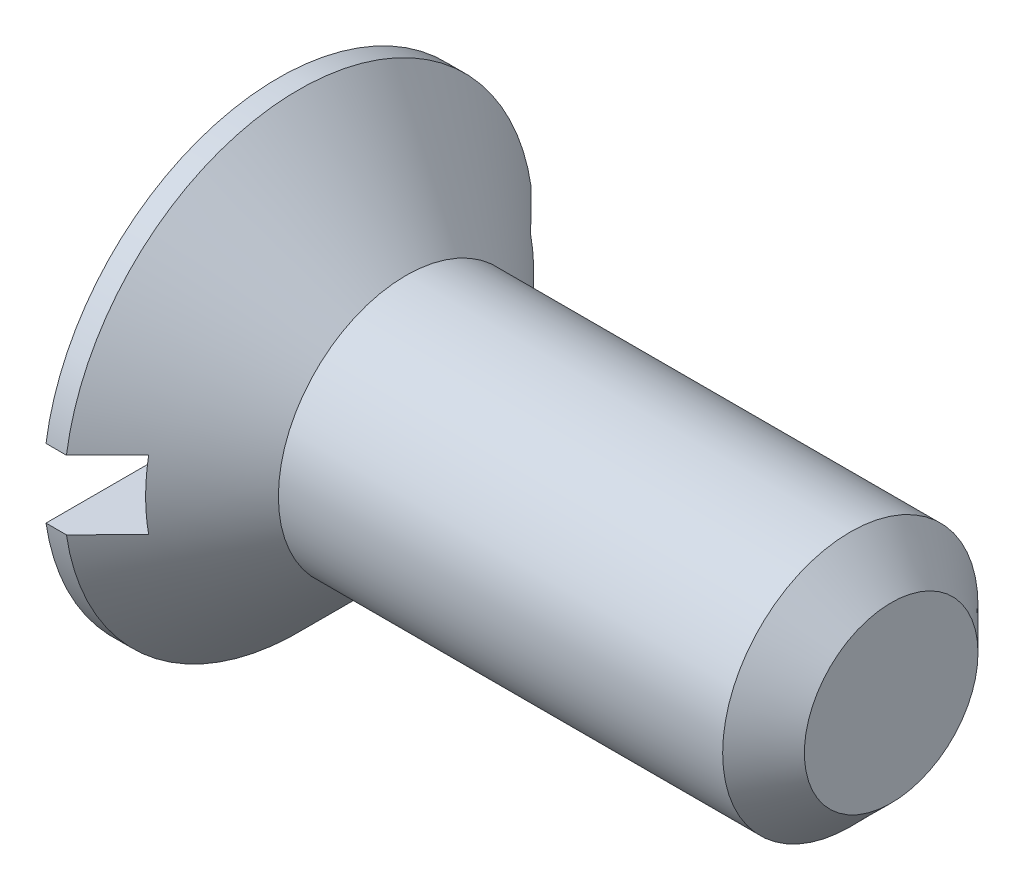
ISO-10303-21;
HEADER;
FILE_DESCRIPTION(('STEP AP214'),'2;1');
FILE_NAME('part.step','',(''),(''),'','','');
FILE_SCHEMA(('AUTOMOTIVE_DESIGN { 1 0 10303 214 1 1 1 1 }'));
ENDSEC;
DATA;
#1=APPLICATION_CONTEXT('core data for automotive mechanical design processes');
#2=APPLICATION_PROTOCOL_DEFINITION('international standard','automotive_design',2000,#1);
#3=PRODUCT_CONTEXT('',#1,'mechanical');
#4=PRODUCT('Part','Part','',(#3));
#5=PRODUCT_RELATED_PRODUCT_CATEGORY('part','',(#4));
#6=PRODUCT_DEFINITION_FORMATION('','',#4);
#7=PRODUCT_DEFINITION_CONTEXT('part definition',#1,'design');
#8=PRODUCT_DEFINITION('design','',#6,#7);
#9=PRODUCT_DEFINITION_SHAPE('','',#8);
#10=(LENGTH_UNIT() NAMED_UNIT(*) SI_UNIT(.MILLI.,.METRE.));
#11=(NAMED_UNIT(*) PLANE_ANGLE_UNIT() SI_UNIT($,.RADIAN.));
#12=(NAMED_UNIT(*) SI_UNIT($,.STERADIAN.) SOLID_ANGLE_UNIT());
#13=UNCERTAINTY_MEASURE_WITH_UNIT(LENGTH_MEASURE(1.E-05),#10,'distance_accuracy_value','');
#14=(GEOMETRIC_REPRESENTATION_CONTEXT(3) GLOBAL_UNCERTAINTY_ASSIGNED_CONTEXT((#13)) GLOBAL_UNIT_ASSIGNED_CONTEXT((#10,
#11,#12)) REPRESENTATION_CONTEXT('',''));
#15=CARTESIAN_POINT('',(0.,0.,0.));
#16=DIRECTION('',(0.,0.,1.));
#17=DIRECTION('',(1.,0.,0.));
#18=AXIS2_PLACEMENT_3D('',#15,#16,#17);
#19=CARTESIAN_POINT('',(0.,0.,0.));
#20=DIRECTION('',(-1.,0.,0.));
#21=DIRECTION('',(0.,0.,1.));
#22=AXIS2_PLACEMENT_3D('',#19,#20,#21);
#23=CYLINDRICAL_SURFACE('',#22,4.6);
#24=CARTESIAN_POINT('',(0.400000000000006,0.,0.));
#25=DIRECTION('',(-1.,0.,0.));
#26=DIRECTION('',(0.,0.,1.));
#27=AXIS2_PLACEMENT_3D('',#24,#25,#26);
#28=CIRCLE('',#27,4.6);
#29=CARTESIAN_POINT('',(0.400000000000006,-0.675,-4.55020603929097));
#30=VERTEX_POINT('',#29);
#31=CARTESIAN_POINT('',(0.400000000000005,-0.675,4.55020603929097));
#32=VERTEX_POINT('',#31);
#33=EDGE_CURVE('E109',#30,#32,#28,.T.);
#34=ORIENTED_EDGE('',*,*,#33,.T.);
#35=DIRECTION('',(-1.,0.,0.));
#36=VECTOR('',#35,1.);
#37=CARTESIAN_POINT('',(0.,-0.675,4.55020603929097));
#38=LINE('',#37,#36);
#39=CARTESIAN_POINT('',(0.,-0.675,4.55020603929097));
#40=VERTEX_POINT('',#39);
#41=EDGE_CURVE('E110',#32,#40,#38,.T.);
#42=ORIENTED_EDGE('',*,*,#41,.T.);
#43=CARTESIAN_POINT('',(0.,0.,0.));
#44=DIRECTION('',(-1.,0.,0.));
#45=DIRECTION('',(0.,0.,1.));
#46=AXIS2_PLACEMENT_3D('',#43,#44,#45);
#47=CIRCLE('',#46,4.6);
#48=CARTESIAN_POINT('',(0.,-0.675,-4.55020603929097));
#49=VERTEX_POINT('',#48);
#50=EDGE_CURVE('E143',#49,#40,#47,.T.);
#51=ORIENTED_EDGE('',*,*,#50,.F.);
#52=DIRECTION('',(-1.,0.,0.));
#53=VECTOR('',#52,1.);
#54=CARTESIAN_POINT('',(0.,-0.675,-4.55020603929097));
#55=LINE('',#54,#53);
#56=EDGE_CURVE('E52',#49,#30,#55,.F.);
#57=ORIENTED_EDGE('',*,*,#56,.T.);
#58=EDGE_LOOP('',(#34,#42,#51,#57));
#59=FACE_BOUND('',#58,.T.);
#60=ADVANCED_FACE('F37',(#59),#23,.T.);
#61=CARTESIAN_POINT('',(0.,0.,0.));
#62=DIRECTION('',(1.,0.,0.));
#63=DIRECTION('',(0.,0.,-1.));
#64=AXIS2_PLACEMENT_3D('',#61,#62,#63);
#65=PLANE('',#64);
#66=CARTESIAN_POINT('',(0.,0.675,4.55020603929097));
#67=VERTEX_POINT('',#66);
#68=CARTESIAN_POINT('',(0.,0.675,-4.55020603929097));
#69=VERTEX_POINT('',#68);
#70=EDGE_CURVE('E150',#67,#69,#47,.T.);
#71=ORIENTED_EDGE('',*,*,#70,.T.);
#72=DIRECTION('',(0.,0.,1.));
#73=VECTOR('',#72,1.);
#74=CARTESIAN_POINT('',(0.,0.675,0.));
#75=LINE('',#74,#73);
#76=EDGE_CURVE('E166',#69,#67,#75,.T.);
#77=ORIENTED_EDGE('',*,*,#76,.T.);
#78=EDGE_LOOP('',(#71,#77));
#79=FACE_BOUND('',#78,.T.);
#80=ADVANCED_FACE('F172',(#79),#65,.F.);
#81=CARTESIAN_POINT('',(12.,0.,0.));
#82=DIRECTION('',(-1.,0.,0.));
#83=DIRECTION('',(0.,0.,1.));
#84=AXIS2_PLACEMENT_3D('',#81,#82,#83);
#85=CYLINDRICAL_SURFACE('',#84,2.5);
#86=CARTESIAN_POINT('',(11.2,0.,0.));
#87=DIRECTION('',(1.,0.,0.));
#88=DIRECTION('',(0.,0.,-1.));
#89=AXIS2_PLACEMENT_3D('',#86,#87,#88);
#90=CIRCLE('',#89,2.5);
#91=CARTESIAN_POINT('',(11.2,0.,-2.5));
#92=VERTEX_POINT('',#91);
#93=EDGE_CURVE('E157',#92,#92,#90,.F.);
#94=ORIENTED_EDGE('',*,*,#93,.T.);
#95=EDGE_LOOP('',(#94));
#96=FACE_BOUND('',#95,.T.);
#97=CARTESIAN_POINT('',(2.5,0.,0.));
#98=DIRECTION('',(-1.,0.,0.));
#99=DIRECTION('',(0.,0.,1.));
#100=AXIS2_PLACEMENT_3D('',#97,#98,#99);
#101=CIRCLE('',#100,2.5);
#102=CARTESIAN_POINT('',(2.5,0.,2.5));
#103=VERTEX_POINT('',#102);
#104=EDGE_CURVE('E161',#103,#103,#101,.T.);
#105=ORIENTED_EDGE('',*,*,#104,.F.);
#106=EDGE_LOOP('',(#105));
#107=FACE_BOUND('',#106,.T.);
#108=ADVANCED_FACE('F174',(#96,#107),#85,.T.);
#109=CARTESIAN_POINT('',(12.,0.,0.));
#110=DIRECTION('',(1.,0.,0.));
#111=DIRECTION('',(0.,0.,-1.));
#112=AXIS2_PLACEMENT_3D('',#109,#110,#111);
#113=PLANE('',#112);
#114=CARTESIAN_POINT('',(12.,0.,0.));
#115=DIRECTION('',(1.,0.,0.));
#116=DIRECTION('',(0.,0.,-1.));
#117=AXIS2_PLACEMENT_3D('',#114,#115,#116);
#118=CIRCLE('',#117,1.7);
#119=CARTESIAN_POINT('',(12.,0.,-1.7));
#120=VERTEX_POINT('',#119);
#121=EDGE_CURVE('E153',#120,#120,#118,.T.);
#122=ORIENTED_EDGE('',*,*,#121,.T.);
#123=EDGE_LOOP('',(#122));
#124=FACE_BOUND('',#123,.T.);
#125=ADVANCED_FACE('F181',(#124),#113,.T.);
#126=CARTESIAN_POINT('',(12.,0.,0.));
#127=DIRECTION('',(-1.,0.,0.));
#128=DIRECTION('',(0.,0.,1.));
#129=AXIS2_PLACEMENT_3D('',#126,#127,#128);
#130=CONICAL_SURFACE('',#129,1.7,0.785398163397448);
#131=ORIENTED_EDGE('',*,*,#93,.F.);
#132=EDGE_LOOP('',(#131));
#133=FACE_BOUND('',#132,.T.);
#134=ORIENTED_EDGE('',*,*,#121,.F.);
#135=EDGE_LOOP('',(#134));
#136=FACE_BOUND('',#135,.T.);
#137=ADVANCED_FACE('F39',(#133,#136),#130,.T.);
#138=CARTESIAN_POINT('',(0.400000000000006,0.675,4.55020603929097));
#139=VERTEX_POINT('',#138);
#140=CARTESIAN_POINT('',(0.400000000000005,0.675,-4.55020603929097));
#141=VERTEX_POINT('',#140);
#142=EDGE_CURVE('E127',#139,#141,#28,.T.);
#143=ORIENTED_EDGE('',*,*,#142,.T.);
#144=DIRECTION('',(-1.,0.,0.));
#145=VECTOR('',#144,1.);
#146=CARTESIAN_POINT('',(0.,0.675,-4.55020603929097));
#147=LINE('',#146,#145);
#148=EDGE_CURVE('E129',#141,#69,#147,.T.);
#149=ORIENTED_EDGE('',*,*,#148,.T.);
#150=ORIENTED_EDGE('',*,*,#70,.F.);
#151=DIRECTION('',(-1.,0.,0.));
#152=VECTOR('',#151,1.);
#153=CARTESIAN_POINT('',(0.,0.675,4.55020603929097));
#154=LINE('',#153,#152);
#155=EDGE_CURVE('E128',#67,#139,#154,.F.);
#156=ORIENTED_EDGE('',*,*,#155,.T.);
#157=EDGE_LOOP('',(#143,#149,#150,#156));
#158=FACE_BOUND('',#157,.T.);
#159=ADVANCED_FACE('F139',(#158),#23,.T.);
#160=CARTESIAN_POINT('',(2.5,0.,0.));
#161=DIRECTION('',(-1.,0.,0.));
#162=DIRECTION('',(0.,0.,1.));
#163=AXIS2_PLACEMENT_3D('',#160,#161,#162);
#164=CONICAL_SURFACE('',#163,2.5,0.78539816339745);
#165=CARTESIAN_POINT('',(1.2,0.,0.));
#166=DIRECTION('',(1.,0.,0.));
#167=DIRECTION('',(0.,0.,-1.));
#168=AXIS2_PLACEMENT_3D('',#165,#166,#167);
#169=CIRCLE('',#168,3.8);
#170=CARTESIAN_POINT('',(1.2,-0.675,-3.7395688254129));
#171=VERTEX_POINT('',#170);
#172=CARTESIAN_POINT('',(1.2,0.675,-3.7395688254129));
#173=VERTEX_POINT('',#172);
#174=EDGE_CURVE('E11',#171,#173,#169,.T.);
#175=ORIENTED_EDGE('',*,*,#174,.T.);
#176=CARTESIAN_POINT('',(-5.14103026269529,0.675000000000001,10.1185408922879));
#177=CARTESIAN_POINT('',(-4.79289882358009,0.675,9.76962957456254));
#178=CARTESIAN_POINT('',(-4.44480155921046,0.675,9.42068413514975));
#179=CARTESIAN_POINT('',(-3.7487119301813,0.675,8.72267368778365));
#180=CARTESIAN_POINT('',(-3.40071956793741,0.675,8.37360867742145));
#181=CARTESIAN_POINT('',(-2.70472151525276,0.675,7.6751524113005));
#182=CARTESIAN_POINT('',(-2.3567159011481,0.675,7.32576107946031));
#183=CARTESIAN_POINT('',(-1.66095133237253,0.675,6.62674746455806));
#184=CARTESIAN_POINT('',(-1.31319237268689,0.675,6.27712518648771));
#185=CARTESIAN_POINT('',(-0.615198666465887,0.675,5.5746263082885));
#186=CARTESIAN_POINT('',(-0.264967065731521,0.675,5.22174658047516));
#187=CARTESIAN_POINT('',(0.259863029091567,0.675,4.69189172390126));
#188=CARTESIAN_POINT('',(0.434725849565922,0.675,4.51517847709478));
#189=CARTESIAN_POINT('',(0.784197549868638,0.675,4.1615032771802));
#190=CARTESIAN_POINT('',(0.958806431336325,0.675,3.98454132569226));
#191=CARTESIAN_POINT('',(1.30760251360431,0.675,3.63030802297131));
#192=CARTESIAN_POINT('',(1.48178982653076,0.675,3.45303678224496));
#193=CARTESIAN_POINT('',(1.8295925296867,0.675,3.09792543601787));
#194=CARTESIAN_POINT('',(2.00320790559689,0.675,2.92008531649082));
#195=CARTESIAN_POINT('',(2.34947157398948,0.675,2.5635019262022));
#196=CARTESIAN_POINT('',(2.52211997424492,0.675,2.38475876048911));
#197=CARTESIAN_POINT('',(2.7797242498298,0.675,2.11534150573261));
#198=CARTESIAN_POINT('',(2.86536257490605,0.675,2.025320497708));
#199=CARTESIAN_POINT('',(3.03596515937131,0.675,1.84464259536496));
#200=CARTESIAN_POINT('',(3.12092942879838,0.675,1.75398571055405));
#201=CARTESIAN_POINT('',(3.2512477642699,0.675,1.61333546698152));
#202=CARTESIAN_POINT('',(3.29696843998676,0.675,1.56368199626714));
#203=CARTESIAN_POINT('',(3.38800725086161,0.675,1.46400460820766));
#204=CARTESIAN_POINT('',(3.43332537641235,0.675,1.41398068207326));
#205=CARTESIAN_POINT('',(3.52343220875017,0.675,1.31344015006122));
#206=CARTESIAN_POINT('',(3.56822081231717,0.675,1.2629234515188));
#207=CARTESIAN_POINT('',(3.65705632394095,0.675,1.16124382235821));
#208=CARTESIAN_POINT('',(3.70110326872385,0.675,1.11008092396));
#209=CARTESIAN_POINT('',(3.77795109002178,0.675,1.01893526420016));
#210=CARTESIAN_POINT('',(3.81097153083123,0.675,0.979138073286284));
#211=CARTESIAN_POINT('',(3.87616144094943,0.675,0.898853910317401));
#212=CARTESIAN_POINT('',(3.90833096455003,0.675,0.858366982542628));
#213=CARTESIAN_POINT('',(3.97149667651463,0.675,0.776451305154085));
#214=CARTESIAN_POINT('',(4.00249230104566,0.675,0.735022117879748));
#215=CARTESIAN_POINT('',(4.06273707248955,0.675,0.650920658969039));
#216=CARTESIAN_POINT('',(4.09198679799452,0.675,0.608248806206697));
#217=CARTESIAN_POINT('',(4.1514758242758,0.675,0.515559434753144));
#218=CARTESIAN_POINT('',(4.18135351051047,0.675,0.46530584224434));
#219=CARTESIAN_POINT('',(4.23543930623563,0.675,0.361764282597546));
#220=CARTESIAN_POINT('',(4.25965593123721,0.675,0.308481024840851));
#221=CARTESIAN_POINT('',(4.29285294829624,0.675,0.213969622658689));
#222=CARTESIAN_POINT('',(4.30420664088936,0.675,0.173608441656053));
#223=CARTESIAN_POINT('',(4.31998732216108,0.675,0.0916129028989921));
#224=CARTESIAN_POINT('',(4.32443797638003,0.675,0.0499833961584734));
#225=CARTESIAN_POINT('',(4.32546222538945,0.675,-0.0335675330059821));
#226=CARTESIAN_POINT('',(4.3220001417335,0.675,-0.0754894245601723));
#227=CARTESIAN_POINT('',(4.30793123699927,0.675,-0.158151576059504));
#228=CARTESIAN_POINT('',(4.29730513813417,0.675,-0.198888337571242));
#229=CARTESIAN_POINT('',(4.27005389788744,0.675,-0.280658350819791));
#230=CARTESIAN_POINT('',(4.25313711973156,0.675,-0.321589942229873));
#231=CARTESIAN_POINT('',(4.21535099736376,0.675,-0.401617263598404));
#232=CARTESIAN_POINT('',(4.19447431006551,0.675,-0.440709411765164));
#233=CARTESIAN_POINT('',(4.14993101684088,0.675,-0.517671391488483));
#234=CARTESIAN_POINT('',(4.1262429196506,0.675,-0.555528558029601));
#235=CARTESIAN_POINT('',(4.07709263435949,0.675,-0.630010620469065));
#236=CARTESIAN_POINT('',(4.05163202132958,0.675,-0.666636568577121));
#237=CARTESIAN_POINT('',(3.99713485116024,0.675,-0.742198320333047));
#238=CARTESIAN_POINT('',(3.96798173570807,0.675,-0.781049467298038));
#239=CARTESIAN_POINT('',(3.90862508022237,0.675,-0.85794370344578));
#240=CARTESIAN_POINT('',(3.87842139938344,0.675,-0.89598668320213));
#241=CARTESIAN_POINT('',(3.78665550291678,0.675,-1.0092369115181));
#242=CARTESIAN_POINT('',(3.72396630182201,0.675,-1.08352811117157));
#243=CARTESIAN_POINT('',(3.59677619963588,0.675,-1.23075809888945));
#244=CARTESIAN_POINT('',(3.53227223494173,0.675,-1.30369420613128));
#245=CARTESIAN_POINT('',(3.4021993807258,0.675,-1.44857109297886));
#246=CARTESIAN_POINT('',(3.33663080224324,0.675,-1.52051215231615));
#247=CARTESIAN_POINT('',(3.2049836926219,0.675,-1.66349952099614));
#248=CARTESIAN_POINT('',(3.13890746185963,0.675,-1.73454795550912));
#249=CARTESIAN_POINT('',(3.00624644085965,0.675,-1.87617751644498));
#250=CARTESIAN_POINT('',(2.93966161426527,0.675,-1.946758608774));
#251=CARTESIAN_POINT('',(2.80619732381264,0.675,-2.08749673474619));
#252=CARTESIAN_POINT('',(2.73931825526489,0.675,-2.15765414369846));
#253=CARTESIAN_POINT('',(2.60528604522793,0.675,-2.29770320663561));
#254=CARTESIAN_POINT('',(2.53813291046404,0.675,-2.36759486706137));
#255=CARTESIAN_POINT('',(2.33696131954182,0.675,-2.57634206727043));
#256=CARTESIAN_POINT('',(2.2026323079358,0.675,-2.71489822056884));
#257=CARTESIAN_POINT('',(1.93345191078397,0.675,-2.99150242168728));
#258=CARTESIAN_POINT('',(1.79860052307259,0.675,-3.12955046739625));
#259=CARTESIAN_POINT('',(1.39352373969183,0.675,-3.54319294674175));
#260=CARTESIAN_POINT('',(1.12278087773808,0.675,-3.81828040668613));
#261=CARTESIAN_POINT('',(0.580484795057651,0.675,-4.36788477847732));
#262=CARTESIAN_POINT('',(0.308931278914151,0.675,-4.6424013982682));
#263=CARTESIAN_POINT('',(-0.234589050858713,0.675,-5.19102029542287));
#264=CARTESIAN_POINT('',(-0.506555860751853,0.675,-5.46512257648817));
#265=CARTESIAN_POINT('',(-1.05075284170247,0.675,-6.0130691122628));
#266=CARTESIAN_POINT('',(-1.32298301451592,0.675,-6.28691336522735));
#267=CARTESIAN_POINT('',(-1.8676214573777,0.675,-6.83442598462294));
#268=CARTESIAN_POINT('',(-2.14002972784651,0.675,-7.10809435063568));
#269=CARTESIAN_POINT('',(-2.95738161898009,0.675,-7.92885951648098));
#270=CARTESIAN_POINT('',(-3.50250895024909,0.675,-8.4757733534304));
#271=CARTESIAN_POINT('',(-4.2299561930072,0.675,-9.2052506136649));
#272=CARTESIAN_POINT('',(-4.41215830310438,0.675000000000001,-9.38793156229447));
#273=CARTESIAN_POINT('',(-4.77657997566316,0.675000000000001,-9.75325901546135));
#274=CARTESIAN_POINT('',(-4.95879953691083,0.675000000000001,-9.93590552120957));
#275=CARTESIAN_POINT('',(-5.14103026269529,0.675000000000001,-10.1185408922879));
#276=B_SPLINE_CURVE_WITH_KNOTS('',3,(#176,#177,#178,#179,#180,#181,#182,#183,#184,#185,#186,
#187,#188,#189,#190,#191,#192,#193,#194,#195,#196,#197,#198,#199,#200,#201,#202,#203,#204,#205,
#206,#207,#208,#209,#210,#211,#212,#213,#214,#215,#216,#217,#218,#219,#220,#221,#222,#223,#224,
#225,#226,#227,#228,#229,#230,#231,#232,#233,#234,#235,#236,#237,#238,#239,#240,#241,#242,#243,
#244,#245,#246,#247,#248,#249,#250,#251,#252,#253,#254,#255,#256,#257,#258,#259,#260,#261,#262,
#263,#264,#265,#266,#267,#268,#269,#270,#271,#272,#273,#274,#275),.UNSPECIFIED.,.F.,.F.,(4,2,2,
2,2,2,2,2,2,2,2,2,2,2,2,2,2,2,2,2,2,2,2,2,2,2,2,2,2,2,2,2,2,2,2,2,2,2,2,2,2,2,2,2,2,2,2,2,2,4),
(0.,1.47865192718212,2.95733563769879,4.43674080068218,5.91611497040963,7.40764925459733,
8.15346486442373,8.89927563800949,9.64485951516977,10.3904619194029,11.1359795003415,
11.5087232623021,11.881461462893,12.0839509309119,12.2864452186204,12.4889783485987,
12.6915014196947,12.8466301757896,13.0017490100672,13.156941427927,13.3120821260542,
13.4872956172294,13.6622438270948,13.7875740615415,13.9124736717613,14.0379375633345,
14.163740422818,14.2963022773377,14.4291123955462,14.5630125161266,14.6967951344729,
14.8424882087667,14.9882008858637,15.2797658928102,15.5718567566469,15.8638637658379,
16.1549372619404,16.4460317637023,16.7368122567765,17.0275856567666,17.6065293699177,
18.1854754857268,19.3433899296495,20.5017963221157,21.6601923040207,22.8185960634945,
23.9770025678292,26.2935745931515,27.0676091168234,27.8416074586142),.UNSPECIFIED.);
#277=EDGE_CURVE('E112',#173,#141,#276,.T.);
#278=ORIENTED_EDGE('',*,*,#277,.T.);
#279=ORIENTED_EDGE('',*,*,#142,.F.);
#280=CARTESIAN_POINT('',(1.2,0.675,3.7395688254129));
#281=VERTEX_POINT('',#280);
#282=EDGE_CURVE('E60',#139,#281,#276,.T.);
#283=ORIENTED_EDGE('',*,*,#282,.T.);
#284=CARTESIAN_POINT('',(1.2,-0.675,3.7395688254129));
#285=VERTEX_POINT('',#284);
#286=EDGE_CURVE('E41',#281,#285,#169,.T.);
#287=ORIENTED_EDGE('',*,*,#286,.T.);
#288=CARTESIAN_POINT('',(-5.14103026269529,-0.675000000000001,-10.1185408922879));
#289=CARTESIAN_POINT('',(-4.79289882358009,-0.675,-9.76962957456254));
#290=CARTESIAN_POINT('',(-4.44480155921045,-0.675,-9.42068413514976));
#291=CARTESIAN_POINT('',(-3.7487119301813,-0.675,-8.72267368778365));
#292=CARTESIAN_POINT('',(-3.40071956793741,-0.675,-8.37360867742145));
#293=CARTESIAN_POINT('',(-2.70472151525276,-0.675,-7.6751524113005));
#294=CARTESIAN_POINT('',(-2.3567159011481,-0.675,-7.32576107946032));
#295=CARTESIAN_POINT('',(-1.66095133237253,-0.675,-6.62674746455806));
#296=CARTESIAN_POINT('',(-1.31319237268689,-0.675,-6.27712518648772));
#297=CARTESIAN_POINT('',(-0.61519866646589,-0.675,-5.57462630828851));
#298=CARTESIAN_POINT('',(-0.264967065731523,-0.675,-5.22174658047516));
#299=CARTESIAN_POINT('',(0.259863029091565,-0.675,-4.69189172390127));
#300=CARTESIAN_POINT('',(0.43472584956592,-0.675,-4.51517847709479));
#301=CARTESIAN_POINT('',(0.784197549868636,-0.675,-4.1615032771802));
#302=CARTESIAN_POINT('',(0.958806431336323,-0.675,-3.98454132569227));
#303=CARTESIAN_POINT('',(1.3076025136043,-0.675,-3.63030802297131));
#304=CARTESIAN_POINT('',(1.48178982653075,-0.675,-3.45303678224497));
#305=CARTESIAN_POINT('',(1.8295925296867,-0.675,-3.09792543601787));
#306=CARTESIAN_POINT('',(2.00320790559689,-0.675,-2.92008531649082));
#307=CARTESIAN_POINT('',(2.34947157398948,-0.675,-2.5635019262022));
#308=CARTESIAN_POINT('',(2.52211997424492,-0.675,-2.38475876048911));
#309=CARTESIAN_POINT('',(2.7797242498298,-0.675,-2.11534150573261));
#310=CARTESIAN_POINT('',(2.86536257490605,-0.675,-2.025320497708));
#311=CARTESIAN_POINT('',(3.03596515937131,-0.675,-1.84464259536496));
#312=CARTESIAN_POINT('',(3.12092942879838,-0.675,-1.75398571055405));
#313=CARTESIAN_POINT('',(3.2512477642699,-0.675,-1.61333546698152));
#314=CARTESIAN_POINT('',(3.29696843998676,-0.675,-1.56368199626714));
#315=CARTESIAN_POINT('',(3.38800725086161,-0.675,-1.46400460820766));
#316=CARTESIAN_POINT('',(3.43332537641235,-0.675,-1.41398068207327));
#317=CARTESIAN_POINT('',(3.52343220875017,-0.675,-1.31344015006122));
#318=CARTESIAN_POINT('',(3.56822081231717,-0.675,-1.2629234515188));
#319=CARTESIAN_POINT('',(3.65705632394095,-0.675,-1.16124382235821));
#320=CARTESIAN_POINT('',(3.70110326872384,-0.675,-1.11008092396));
#321=CARTESIAN_POINT('',(3.77795109002178,-0.675,-1.01893526420016));
#322=CARTESIAN_POINT('',(3.81097153083124,-0.675,-0.979138073286283));
#323=CARTESIAN_POINT('',(3.87616144094943,-0.675,-0.8988539103174));
#324=CARTESIAN_POINT('',(3.90833096455003,-0.675,-0.858366982542628));
#325=CARTESIAN_POINT('',(3.97149667651463,-0.675,-0.776451305154086));
#326=CARTESIAN_POINT('',(4.00249230104566,-0.675,-0.735022117879748));
#327=CARTESIAN_POINT('',(4.06273707248955,-0.675,-0.65092065896904));
#328=CARTESIAN_POINT('',(4.09198679799452,-0.675,-0.608248806206697));
#329=CARTESIAN_POINT('',(4.1514758242758,-0.675,-0.515559434753144));
#330=CARTESIAN_POINT('',(4.18135351051047,-0.675,-0.46530584224434));
#331=CARTESIAN_POINT('',(4.23543930623563,-0.675,-0.361764282597546));
#332=CARTESIAN_POINT('',(4.25965593123721,-0.675,-0.308481024840851));
#333=CARTESIAN_POINT('',(4.29285294829624,-0.675,-0.213969622658689));
#334=CARTESIAN_POINT('',(4.30420664088936,-0.675,-0.173608441656053));
#335=CARTESIAN_POINT('',(4.31998732216108,-0.675,-0.091612902898992));
#336=CARTESIAN_POINT('',(4.32443797638003,-0.675,-0.0499833961584734));
#337=CARTESIAN_POINT('',(4.32546222538945,-0.675,0.0335675330059821));
#338=CARTESIAN_POINT('',(4.3220001417335,-0.675,0.0754894245601724));
#339=CARTESIAN_POINT('',(4.30793123699927,-0.675,0.158151576059505));
#340=CARTESIAN_POINT('',(4.29730513813417,-0.675,0.198888337571242));
#341=CARTESIAN_POINT('',(4.27005389788744,-0.675,0.280658350819791));
#342=CARTESIAN_POINT('',(4.25313711973156,-0.675,0.321589942229873));
#343=CARTESIAN_POINT('',(4.21535099736376,-0.675,0.401617263598404));
#344=CARTESIAN_POINT('',(4.19447431006551,-0.675,0.440709411765164));
#345=CARTESIAN_POINT('',(4.14993101684088,-0.675,0.517671391488483));
#346=CARTESIAN_POINT('',(4.1262429196506,-0.675,0.555528558029601));
#347=CARTESIAN_POINT('',(4.07709263435949,-0.675,0.630010620469066));
#348=CARTESIAN_POINT('',(4.05163202132958,-0.675,0.666636568577122));
#349=CARTESIAN_POINT('',(3.99713485116024,-0.675,0.742198320333048));
#350=CARTESIAN_POINT('',(3.96798173570806,-0.675,0.78104946729804));
#351=CARTESIAN_POINT('',(3.90862508022237,-0.675,0.857943703445782));
#352=CARTESIAN_POINT('',(3.87842139938344,-0.675,0.895986683202132));
#353=CARTESIAN_POINT('',(3.78665550291678,-0.675,1.0092369115181));
#354=CARTESIAN_POINT('',(3.72396630182201,-0.675,1.08352811117157));
#355=CARTESIAN_POINT('',(3.59677619963588,-0.675,1.23075809888945));
#356=CARTESIAN_POINT('',(3.53227223494173,-0.675,1.30369420613128));
#357=CARTESIAN_POINT('',(3.40219938072579,-0.675,1.44857109297886));
#358=CARTESIAN_POINT('',(3.33663080224324,-0.675,1.52051215231616));
#359=CARTESIAN_POINT('',(3.20498369262189,-0.675,1.66349952099614));
#360=CARTESIAN_POINT('',(3.13890746185963,-0.675,1.73454795550913));
#361=CARTESIAN_POINT('',(3.00624644085965,-0.675,1.87617751644498));
#362=CARTESIAN_POINT('',(2.93966161426527,-0.675,1.946758608774));
#363=CARTESIAN_POINT('',(2.80619732381264,-0.675,2.08749673474619));
#364=CARTESIAN_POINT('',(2.73931825526489,-0.675,2.15765414369846));
#365=CARTESIAN_POINT('',(2.60528604522792,-0.675,2.29770320663561));
#366=CARTESIAN_POINT('',(2.53813291046404,-0.675,2.36759486706137));
#367=CARTESIAN_POINT('',(2.33696131954182,-0.675,2.57634206727043));
#368=CARTESIAN_POINT('',(2.2026323079358,-0.675,2.71489822056884));
#369=CARTESIAN_POINT('',(1.93345191078397,-0.675,2.99150242168728));
#370=CARTESIAN_POINT('',(1.79860052307259,-0.675,3.12955046739625));
#371=CARTESIAN_POINT('',(1.39352373969183,-0.675,3.54319294674175));
#372=CARTESIAN_POINT('',(1.12278087773808,-0.675,3.81828040668613));
#373=CARTESIAN_POINT('',(0.580484795057645,-0.675,4.36788477847732));
#374=CARTESIAN_POINT('',(0.308931278914143,-0.675,4.6424013982682));
#375=CARTESIAN_POINT('',(-0.234589050858721,-0.675,5.19102029542288));
#376=CARTESIAN_POINT('',(-0.506555860751862,-0.675,5.46512257648818));
#377=CARTESIAN_POINT('',(-1.05075284170248,-0.675,6.01306911226281));
#378=CARTESIAN_POINT('',(-1.32298301451593,-0.675,6.28691336522736));
#379=CARTESIAN_POINT('',(-1.86762145737771,-0.675,6.83442598462295));
#380=CARTESIAN_POINT('',(-2.14002972784652,-0.675,7.10809435063569));
#381=CARTESIAN_POINT('',(-2.9573816189801,-0.675,7.92885951648099));
#382=CARTESIAN_POINT('',(-3.5025089502491,-0.675,8.47577335343041));
#383=CARTESIAN_POINT('',(-4.22995619300721,-0.675,9.20525061366491));
#384=CARTESIAN_POINT('',(-4.41215830310439,-0.675000000000001,9.38793156229448));
#385=CARTESIAN_POINT('',(-4.77657997566316,-0.675000000000001,9.75325901546136));
#386=CARTESIAN_POINT('',(-4.95879953691083,-0.675000000000001,9.93590552120957));
#387=CARTESIAN_POINT('',(-5.14103026269529,-0.675000000000001,10.1185408922879));
#388=B_SPLINE_CURVE_WITH_KNOTS('',3,(#288,#289,#290,#291,#292,#293,#294,#295,#296,#297,#298,
#299,#300,#301,#302,#303,#304,#305,#306,#307,#308,#309,#310,#311,#312,#313,#314,#315,#316,#317,
#318,#319,#320,#321,#322,#323,#324,#325,#326,#327,#328,#329,#330,#331,#332,#333,#334,#335,#336,
#337,#338,#339,#340,#341,#342,#343,#344,#345,#346,#347,#348,#349,#350,#351,#352,#353,#354,#355,
#356,#357,#358,#359,#360,#361,#362,#363,#364,#365,#366,#367,#368,#369,#370,#371,#372,#373,#374,
#375,#376,#377,#378,#379,#380,#381,#382,#383,#384,#385,#386,#387),.UNSPECIFIED.,.F.,.F.,(4,2,2,
2,2,2,2,2,2,2,2,2,2,2,2,2,2,2,2,2,2,2,2,2,2,2,2,2,2,2,2,2,2,2,2,2,2,2,2,2,2,2,2,2,2,2,2,2,2,4),
(0.,1.47865192718212,2.95733563769879,4.43674080068218,5.91611497040962,7.40764925459733,
8.15346486442373,8.89927563800949,9.64485951516976,10.3904619194029,11.1359795003415,
11.5087232623021,11.881461462893,12.0839509309119,12.2864452186204,12.4889783485987,
12.6915014196947,12.8466301757896,13.0017490100672,13.156941427927,13.3120821260542,
13.4872956172294,13.6622438270948,13.7875740615415,13.9124736717613,14.0379375633345,
14.163740422818,14.2963022773377,14.4291123955462,14.5630125161266,14.6967951344729,
14.8424882087667,14.9882008858637,15.2797658928102,15.5718567566469,15.8638637658379,
16.1549372619404,16.4460317637023,16.7368122567765,17.0275856567666,17.6065293699177,
18.1854754857268,19.3433899296495,20.5017963221157,21.6601923040207,22.8185960634945,
23.9770025678292,26.2935745931516,27.0676091168234,27.8416074586142),.UNSPECIFIED.);
#389=EDGE_CURVE('E102',#285,#32,#388,.T.);
#390=ORIENTED_EDGE('',*,*,#389,.T.);
#391=ORIENTED_EDGE('',*,*,#33,.F.);
#392=EDGE_CURVE('E100',#30,#171,#388,.T.);
#393=ORIENTED_EDGE('',*,*,#392,.T.);
#394=EDGE_LOOP('',(#175,#278,#279,#283,#287,#390,#391,#393));
#395=FACE_BOUND('',#394,.T.);
#396=ORIENTED_EDGE('',*,*,#104,.T.);
#397=EDGE_LOOP('',(#396));
#398=FACE_BOUND('',#397,.T.);
#399=ADVANCED_FACE('F106',(#395,#398),#164,.T.);
#400=ORIENTED_EDGE('',*,*,#50,.T.);
#401=DIRECTION('',(0.,0.,-1.));
#402=VECTOR('',#401,1.);
#403=CARTESIAN_POINT('',(0.,-0.675,0.));
#404=LINE('',#403,#402);
#405=EDGE_CURVE('E164',#40,#49,#404,.T.);
#406=ORIENTED_EDGE('',*,*,#405,.T.);
#407=EDGE_LOOP('',(#400,#406));
#408=FACE_BOUND('',#407,.T.);
#409=ADVANCED_FACE('F176',(#408),#65,.F.);
#410=CARTESIAN_POINT('',(1.2,0.675,-4.6));
#411=DIRECTION('',(1.,0.,0.));
#412=DIRECTION('',(0.,0.,-1.));
#413=AXIS2_PLACEMENT_3D('',#410,#411,#412);
#414=PLANE('',#413);
#415=DIRECTION('',(0.,0.,1.));
#416=VECTOR('',#415,1.);
#417=CARTESIAN_POINT('',(1.2,0.675,-4.6));
#418=LINE('',#417,#416);
#419=EDGE_CURVE('E95',#173,#281,#418,.T.);
#420=ORIENTED_EDGE('',*,*,#419,.F.);
#421=ORIENTED_EDGE('',*,*,#174,.F.);
#422=DIRECTION('',(0.,0.,1.));
#423=VECTOR('',#422,1.);
#424=CARTESIAN_POINT('',(1.2,-0.675,-4.6));
#425=LINE('',#424,#423);
#426=EDGE_CURVE('E93',#171,#285,#425,.T.);
#427=ORIENTED_EDGE('',*,*,#426,.T.);
#428=ORIENTED_EDGE('',*,*,#286,.F.);
#429=EDGE_LOOP('',(#420,#421,#427,#428));
#430=FACE_BOUND('',#429,.T.);
#431=ADVANCED_FACE('F92',(#430),#414,.F.);
#432=CARTESIAN_POINT('',(0.,0.675,-4.6));
#433=DIRECTION('',(0.,1.,0.));
#434=DIRECTION('',(-1.,0.,0.));
#435=AXIS2_PLACEMENT_3D('',#432,#433,#434);
#436=PLANE('',#435);
#437=ORIENTED_EDGE('',*,*,#76,.F.);
#438=ORIENTED_EDGE('',*,*,#148,.F.);
#439=ORIENTED_EDGE('',*,*,#277,.F.);
#440=ORIENTED_EDGE('',*,*,#419,.T.);
#441=ORIENTED_EDGE('',*,*,#282,.F.);
#442=ORIENTED_EDGE('',*,*,#155,.F.);
#443=EDGE_LOOP('',(#437,#438,#439,#440,#441,#442));
#444=FACE_BOUND('',#443,.T.);
#445=ADVANCED_FACE('F124',(#444),#436,.F.);
#446=CARTESIAN_POINT('',(1.2,-0.675,-4.6));
#447=DIRECTION('',(0.,-1.,0.));
#448=DIRECTION('',(1.,0.,0.));
#449=AXIS2_PLACEMENT_3D('',#446,#447,#448);
#450=PLANE('',#449);
#451=ORIENTED_EDGE('',*,*,#405,.F.);
#452=ORIENTED_EDGE('',*,*,#41,.F.);
#453=ORIENTED_EDGE('',*,*,#389,.F.);
#454=ORIENTED_EDGE('',*,*,#426,.F.);
#455=ORIENTED_EDGE('',*,*,#392,.F.);
#456=ORIENTED_EDGE('',*,*,#56,.F.);
#457=EDGE_LOOP('',(#451,#452,#453,#454,#455,#456));
#458=FACE_BOUND('',#457,.T.);
#459=ADVANCED_FACE('F99',(#458),#450,.F.);
#460=CLOSED_SHELL('',(#60,#80,#108,#125,#137,#159,#399,#409,#431,#445,#459));
#461=MANIFOLD_SOLID_BREP('B2',#460);
#462=ADVANCED_BREP_SHAPE_REPRESENTATION('',(#18,#461),#14);
#463=SHAPE_DEFINITION_REPRESENTATION(#9,#462);
ENDSEC;
END-ISO-10303-21;
